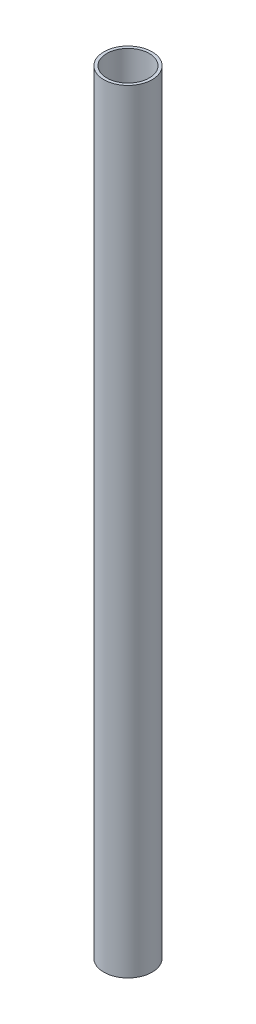
ISO-10303-21;
HEADER;
FILE_DESCRIPTION(('STEP AP214'),'2;1');
FILE_NAME('part.step','',(''),(''),'','','');
FILE_SCHEMA(('AUTOMOTIVE_DESIGN { 1 0 10303 214 1 1 1 1 }'));
ENDSEC;
DATA;
#1=APPLICATION_CONTEXT('core data for automotive mechanical design processes');
#2=APPLICATION_PROTOCOL_DEFINITION('international standard','automotive_design',2000,#1);
#3=PRODUCT_CONTEXT('',#1,'mechanical');
#4=PRODUCT('Part','Part','',(#3));
#5=PRODUCT_RELATED_PRODUCT_CATEGORY('part','',(#4));
#6=PRODUCT_DEFINITION_FORMATION('','',#4);
#7=PRODUCT_DEFINITION_CONTEXT('part definition',#1,'design');
#8=PRODUCT_DEFINITION('design','',#6,#7);
#9=PRODUCT_DEFINITION_SHAPE('','',#8);
#10=(LENGTH_UNIT() NAMED_UNIT(*) SI_UNIT(.MILLI.,.METRE.));
#11=(NAMED_UNIT(*) PLANE_ANGLE_UNIT() SI_UNIT($,.RADIAN.));
#12=(NAMED_UNIT(*) SI_UNIT($,.STERADIAN.) SOLID_ANGLE_UNIT());
#13=UNCERTAINTY_MEASURE_WITH_UNIT(LENGTH_MEASURE(1.E-05),#10,'distance_accuracy_value','');
#14=(GEOMETRIC_REPRESENTATION_CONTEXT(3) GLOBAL_UNCERTAINTY_ASSIGNED_CONTEXT((#13)) GLOBAL_UNIT_ASSIGNED_CONTEXT((#10,
#11,#12)) REPRESENTATION_CONTEXT('',''));
#15=CARTESIAN_POINT('',(0.,0.,0.));
#16=DIRECTION('',(0.,0.,1.));
#17=DIRECTION('',(1.,0.,0.));
#18=AXIS2_PLACEMENT_3D('',#15,#16,#17);
#19=CARTESIAN_POINT('',(0.,400.,0.));
#20=DIRECTION('',(0.,1.,0.));
#21=DIRECTION('',(0.,0.,1.));
#22=AXIS2_PLACEMENT_3D('',#19,#20,#21);
#23=PLANE('',#22);
#24=CARTESIAN_POINT('',(0.,400.,0.));
#25=DIRECTION('',(0.,1.,0.));
#26=DIRECTION('',(0.,0.,1.));
#27=AXIS2_PLACEMENT_3D('',#24,#25,#26);
#28=CIRCLE('',#27,12.5);
#29=CARTESIAN_POINT('',(0.,400.,12.5));
#30=VERTEX_POINT('',#29);
#31=EDGE_CURVE('E11',#30,#30,#28,.T.);
#32=ORIENTED_EDGE('',*,*,#31,.T.);
#33=EDGE_LOOP('',(#32));
#34=FACE_BOUND('',#33,.T.);
#35=CARTESIAN_POINT('',(0.,400.,0.));
#36=DIRECTION('',(0.,1.,0.));
#37=DIRECTION('',(1.,0.,0.));
#38=AXIS2_PLACEMENT_3D('',#35,#36,#37);
#39=CIRCLE('',#38,11.);
#40=CARTESIAN_POINT('',(11.,400.,0.));
#41=VERTEX_POINT('',#40);
#42=EDGE_CURVE('E57',#41,#41,#39,.T.);
#43=ORIENTED_EDGE('',*,*,#42,.F.);
#44=EDGE_LOOP('',(#43));
#45=FACE_BOUND('',#44,.T.);
#46=ADVANCED_FACE('F46',(#34,#45),#23,.T.);
#47=CARTESIAN_POINT('',(0.,0.,0.));
#48=DIRECTION('',(0.,1.,0.));
#49=DIRECTION('',(0.,0.,1.));
#50=AXIS2_PLACEMENT_3D('',#47,#48,#49);
#51=PLANE('',#50);
#52=CARTESIAN_POINT('',(0.,0.,0.));
#53=DIRECTION('',(0.,1.,0.));
#54=DIRECTION('',(0.,0.,1.));
#55=AXIS2_PLACEMENT_3D('',#52,#53,#54);
#56=CIRCLE('',#55,12.5);
#57=CARTESIAN_POINT('',(0.,0.,12.5));
#58=VERTEX_POINT('',#57);
#59=EDGE_CURVE('E50',#58,#58,#56,.T.);
#60=ORIENTED_EDGE('',*,*,#59,.F.);
#61=EDGE_LOOP('',(#60));
#62=FACE_BOUND('',#61,.T.);
#63=CARTESIAN_POINT('',(0.,0.,0.));
#64=DIRECTION('',(0.,1.,0.));
#65=DIRECTION('',(1.,0.,0.));
#66=AXIS2_PLACEMENT_3D('',#63,#64,#65);
#67=CIRCLE('',#66,11.);
#68=CARTESIAN_POINT('',(11.,0.,0.));
#69=VERTEX_POINT('',#68);
#70=EDGE_CURVE('E59',#69,#69,#67,.T.);
#71=ORIENTED_EDGE('',*,*,#70,.T.);
#72=EDGE_LOOP('',(#71));
#73=FACE_BOUND('',#72,.T.);
#74=ADVANCED_FACE('F69',(#62,#73),#51,.F.);
#75=CARTESIAN_POINT('',(0.,400.,0.));
#76=DIRECTION('',(0.,-1.,0.));
#77=DIRECTION('',(0.,0.,-1.));
#78=AXIS2_PLACEMENT_3D('',#75,#76,#77);
#79=CYLINDRICAL_SURFACE('',#78,12.5);
#80=ORIENTED_EDGE('',*,*,#31,.F.);
#81=EDGE_LOOP('',(#80));
#82=FACE_BOUND('',#81,.T.);
#83=ORIENTED_EDGE('',*,*,#59,.T.);
#84=EDGE_LOOP('',(#83));
#85=FACE_BOUND('',#84,.T.);
#86=ADVANCED_FACE('F48',(#82,#85),#79,.T.);
#87=CARTESIAN_POINT('',(0.,400.,0.));
#88=DIRECTION('',(0.,-1.,0.));
#89=DIRECTION('',(0.,0.,-1.));
#90=AXIS2_PLACEMENT_3D('',#87,#88,#89);
#91=CYLINDRICAL_SURFACE('',#90,11.);
#92=ORIENTED_EDGE('',*,*,#42,.T.);
#93=EDGE_LOOP('',(#92));
#94=FACE_BOUND('',#93,.T.);
#95=ORIENTED_EDGE('',*,*,#70,.F.);
#96=EDGE_LOOP('',(#95));
#97=FACE_BOUND('',#96,.T.);
#98=ADVANCED_FACE('F65',(#94,#97),#91,.F.);
#99=CLOSED_SHELL('',(#46,#74,#86,#98));
#100=MANIFOLD_SOLID_BREP('B2',#99);
#101=ADVANCED_BREP_SHAPE_REPRESENTATION('',(#18,#100),#14);
#102=SHAPE_DEFINITION_REPRESENTATION(#9,#101);
ENDSEC;
END-ISO-10303-21;
